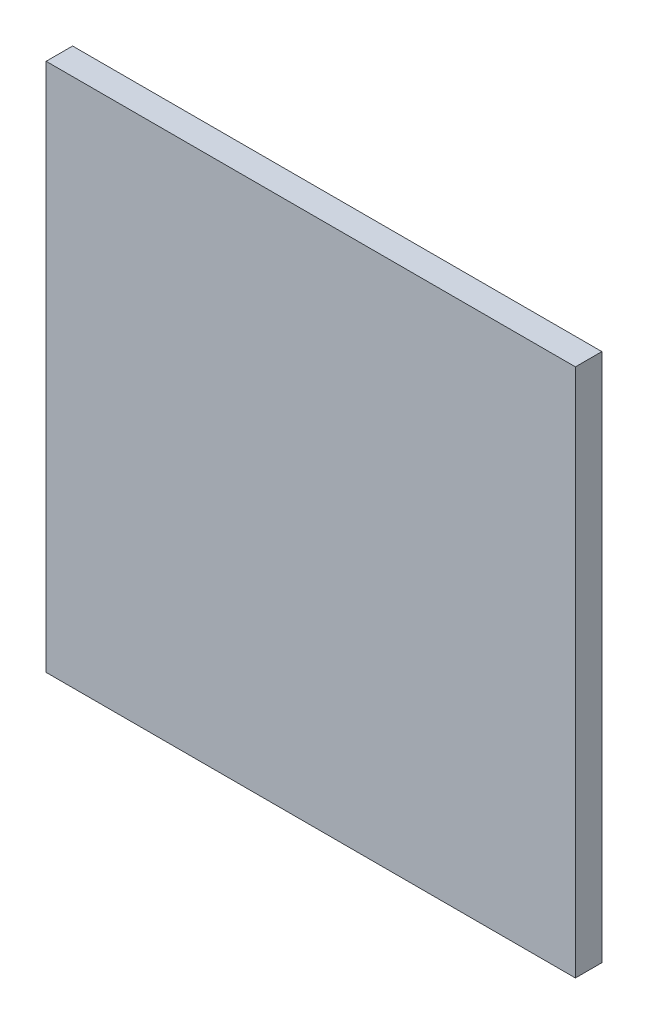
ISO-10303-21;
HEADER;
FILE_DESCRIPTION(('STEP AP214'),'2;1');
FILE_NAME('part.step','',(''),(''),'','','');
FILE_SCHEMA(('AUTOMOTIVE_DESIGN { 1 0 10303 214 1 1 1 1 }'));
ENDSEC;
DATA;
#1=APPLICATION_CONTEXT('core data for automotive mechanical design processes');
#2=APPLICATION_PROTOCOL_DEFINITION('international standard','automotive_design',2000,#1);
#3=PRODUCT_CONTEXT('',#1,'mechanical');
#4=PRODUCT('Part','Part','',(#3));
#5=PRODUCT_RELATED_PRODUCT_CATEGORY('part','',(#4));
#6=PRODUCT_DEFINITION_FORMATION('','',#4);
#7=PRODUCT_DEFINITION_CONTEXT('part definition',#1,'design');
#8=PRODUCT_DEFINITION('design','',#6,#7);
#9=PRODUCT_DEFINITION_SHAPE('','',#8);
#10=(LENGTH_UNIT() NAMED_UNIT(*) SI_UNIT(.MILLI.,.METRE.));
#11=(NAMED_UNIT(*) PLANE_ANGLE_UNIT() SI_UNIT($,.RADIAN.));
#12=(NAMED_UNIT(*) SI_UNIT($,.STERADIAN.) SOLID_ANGLE_UNIT());
#13=UNCERTAINTY_MEASURE_WITH_UNIT(LENGTH_MEASURE(1.E-05),#10,'distance_accuracy_value','');
#14=(GEOMETRIC_REPRESENTATION_CONTEXT(3) GLOBAL_UNCERTAINTY_ASSIGNED_CONTEXT((#13)) GLOBAL_UNIT_ASSIGNED_CONTEXT((#10,
#11,#12)) REPRESENTATION_CONTEXT('',''));
#15=CARTESIAN_POINT('',(0.,0.,0.));
#16=DIRECTION('',(0.,0.,1.));
#17=DIRECTION('',(1.,0.,0.));
#18=AXIS2_PLACEMENT_3D('',#15,#16,#17);
#19=CARTESIAN_POINT('',(40.,40.,4.));
#20=DIRECTION('',(-1.,0.,0.));
#21=DIRECTION('',(0.,0.,1.));
#22=AXIS2_PLACEMENT_3D('',#19,#20,#21);
#23=PLANE('',#22);
#24=DIRECTION('',(0.,1.,0.));
#25=VECTOR('',#24,1.);
#26=CARTESIAN_POINT('',(40.,40.,0.));
#27=LINE('',#26,#25);
#28=CARTESIAN_POINT('',(40.,-40.,0.));
#29=VERTEX_POINT('',#28);
#30=CARTESIAN_POINT('',(40.,40.,0.));
#31=VERTEX_POINT('',#30);
#32=EDGE_CURVE('E100',#29,#31,#27,.T.);
#33=ORIENTED_EDGE('',*,*,#32,.T.);
#34=DIRECTION('',(0.,0.,-1.));
#35=VECTOR('',#34,1.);
#36=CARTESIAN_POINT('',(40.,40.,4.));
#37=LINE('',#36,#35);
#38=CARTESIAN_POINT('',(40.,40.,4.));
#39=VERTEX_POINT('',#38);
#40=EDGE_CURVE('E11',#39,#31,#37,.T.);
#41=ORIENTED_EDGE('',*,*,#40,.F.);
#42=DIRECTION('',(0.,1.,0.));
#43=VECTOR('',#42,1.);
#44=CARTESIAN_POINT('',(40.,40.,4.));
#45=LINE('',#44,#43);
#46=CARTESIAN_POINT('',(40.,-40.,4.));
#47=VERTEX_POINT('',#46);
#48=EDGE_CURVE('E88',#47,#39,#45,.T.);
#49=ORIENTED_EDGE('',*,*,#48,.F.);
#50=DIRECTION('',(0.,0.,-1.));
#51=VECTOR('',#50,1.);
#52=CARTESIAN_POINT('',(40.,-40.,4.));
#53=LINE('',#52,#51);
#54=EDGE_CURVE('E96',#47,#29,#53,.T.);
#55=ORIENTED_EDGE('',*,*,#54,.T.);
#56=EDGE_LOOP('',(#33,#41,#49,#55));
#57=FACE_BOUND('',#56,.T.);
#58=ADVANCED_FACE('F37',(#57),#23,.F.);
#59=CARTESIAN_POINT('',(-40.,40.,4.));
#60=DIRECTION('',(0.,-1.,0.));
#61=DIRECTION('',(0.,0.,-1.));
#62=AXIS2_PLACEMENT_3D('',#59,#60,#61);
#63=PLANE('',#62);
#64=DIRECTION('',(-1.,0.,0.));
#65=VECTOR('',#64,1.);
#66=CARTESIAN_POINT('',(-40.,40.,0.));
#67=LINE('',#66,#65);
#68=CARTESIAN_POINT('',(-40.,40.,0.));
#69=VERTEX_POINT('',#68);
#70=EDGE_CURVE('E92',#31,#69,#67,.T.);
#71=ORIENTED_EDGE('',*,*,#70,.T.);
#72=DIRECTION('',(0.,0.,-1.));
#73=VECTOR('',#72,1.);
#74=CARTESIAN_POINT('',(-40.,40.,4.));
#75=LINE('',#74,#73);
#76=CARTESIAN_POINT('',(-40.,40.,4.));
#77=VERTEX_POINT('',#76);
#78=EDGE_CURVE('E45',#77,#69,#75,.T.);
#79=ORIENTED_EDGE('',*,*,#78,.F.);
#80=DIRECTION('',(-1.,0.,0.));
#81=VECTOR('',#80,1.);
#82=CARTESIAN_POINT('',(-40.,40.,4.));
#83=LINE('',#82,#81);
#84=EDGE_CURVE('E83',#39,#77,#83,.T.);
#85=ORIENTED_EDGE('',*,*,#84,.F.);
#86=ORIENTED_EDGE('',*,*,#40,.T.);
#87=EDGE_LOOP('',(#71,#79,#85,#86));
#88=FACE_BOUND('',#87,.T.);
#89=ADVANCED_FACE('F91',(#88),#63,.F.);
#90=CARTESIAN_POINT('',(-40.,40.,4.));
#91=DIRECTION('',(1.,0.,0.));
#92=DIRECTION('',(0.,1.,0.));
#93=AXIS2_PLACEMENT_3D('',#90,#91,#92);
#94=PLANE('',#93);
#95=DIRECTION('',(0.,-1.,0.));
#96=VECTOR('',#95,1.);
#97=CARTESIAN_POINT('',(-40.,40.,0.));
#98=LINE('',#97,#96);
#99=CARTESIAN_POINT('',(-40.,-40.,0.));
#100=VERTEX_POINT('',#99);
#101=EDGE_CURVE('E70',#69,#100,#98,.T.);
#102=ORIENTED_EDGE('',*,*,#101,.T.);
#103=DIRECTION('',(0.,0.,-1.));
#104=VECTOR('',#103,1.);
#105=CARTESIAN_POINT('',(-40.,-40.,4.));
#106=LINE('',#105,#104);
#107=CARTESIAN_POINT('',(-40.,-40.,4.));
#108=VERTEX_POINT('',#107);
#109=EDGE_CURVE('E93',#108,#100,#106,.T.);
#110=ORIENTED_EDGE('',*,*,#109,.F.);
#111=DIRECTION('',(0.,-1.,0.));
#112=VECTOR('',#111,1.);
#113=CARTESIAN_POINT('',(-40.,40.,4.));
#114=LINE('',#113,#112);
#115=EDGE_CURVE('E86',#77,#108,#114,.T.);
#116=ORIENTED_EDGE('',*,*,#115,.F.);
#117=ORIENTED_EDGE('',*,*,#78,.T.);
#118=EDGE_LOOP('',(#102,#110,#116,#117));
#119=FACE_BOUND('',#118,.T.);
#120=ADVANCED_FACE('F94',(#119),#94,.F.);
#121=CARTESIAN_POINT('',(-40.,-40.,4.));
#122=DIRECTION('',(0.,1.,0.));
#123=DIRECTION('',(0.,0.,1.));
#124=AXIS2_PLACEMENT_3D('',#121,#122,#123);
#125=PLANE('',#124);
#126=DIRECTION('',(1.,0.,0.));
#127=VECTOR('',#126,1.);
#128=CARTESIAN_POINT('',(-40.,-40.,0.));
#129=LINE('',#128,#127);
#130=EDGE_CURVE('E76',#100,#29,#129,.T.);
#131=ORIENTED_EDGE('',*,*,#130,.T.);
#132=ORIENTED_EDGE('',*,*,#54,.F.);
#133=DIRECTION('',(1.,0.,0.));
#134=VECTOR('',#133,1.);
#135=CARTESIAN_POINT('',(-40.,-40.,4.));
#136=LINE('',#135,#134);
#137=EDGE_CURVE('E53',#108,#47,#136,.T.);
#138=ORIENTED_EDGE('',*,*,#137,.F.);
#139=ORIENTED_EDGE('',*,*,#109,.T.);
#140=EDGE_LOOP('',(#131,#132,#138,#139));
#141=FACE_BOUND('',#140,.T.);
#142=ADVANCED_FACE('F107',(#141),#125,.F.);
#143=CARTESIAN_POINT('',(0.,0.,4.));
#144=DIRECTION('',(0.,0.,1.));
#145=DIRECTION('',(1.,0.,0.));
#146=AXIS2_PLACEMENT_3D('',#143,#144,#145);
#147=PLANE('',#146);
#148=ORIENTED_EDGE('',*,*,#48,.T.);
#149=ORIENTED_EDGE('',*,*,#84,.T.);
#150=ORIENTED_EDGE('',*,*,#115,.T.);
#151=ORIENTED_EDGE('',*,*,#137,.T.);
#152=EDGE_LOOP('',(#148,#149,#150,#151));
#153=FACE_BOUND('',#152,.T.);
#154=ADVANCED_FACE('F84',(#153),#147,.T.);
#155=CARTESIAN_POINT('',(0.,0.,0.));
#156=DIRECTION('',(0.,0.,1.));
#157=DIRECTION('',(1.,0.,0.));
#158=AXIS2_PLACEMENT_3D('',#155,#156,#157);
#159=PLANE('',#158);
#160=ORIENTED_EDGE('',*,*,#32,.F.);
#161=ORIENTED_EDGE('',*,*,#130,.F.);
#162=ORIENTED_EDGE('',*,*,#101,.F.);
#163=ORIENTED_EDGE('',*,*,#70,.F.);
#164=EDGE_LOOP('',(#160,#161,#162,#163));
#165=FACE_BOUND('',#164,.T.);
#166=ADVANCED_FACE('F110',(#165),#159,.F.);
#167=CLOSED_SHELL('',(#58,#89,#120,#142,#154,#166));
#168=MANIFOLD_SOLID_BREP('B2',#167);
#169=ADVANCED_BREP_SHAPE_REPRESENTATION('',(#18,#168),#14);
#170=SHAPE_DEFINITION_REPRESENTATION(#9,#169);
ENDSEC;
END-ISO-10303-21;
